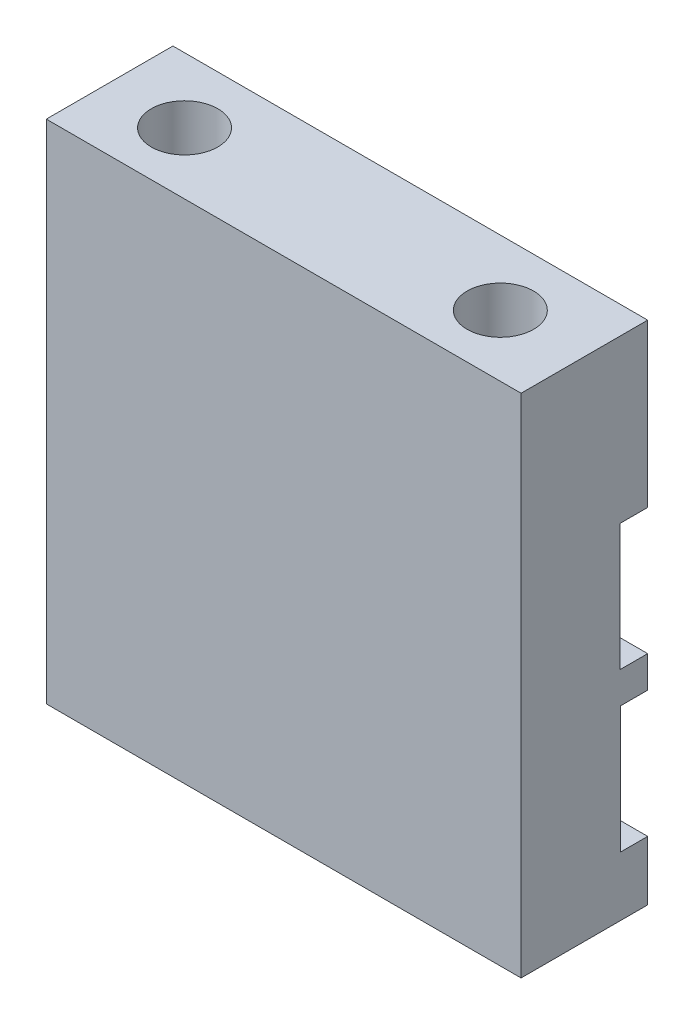
ISO-10303-21;
HEADER;
FILE_DESCRIPTION(('STEP AP214'),'2;1');
FILE_NAME('part.step','',(''),(''),'','','');
FILE_SCHEMA(('AUTOMOTIVE_DESIGN { 1 0 10303 214 1 1 1 1 }'));
ENDSEC;
DATA;
#1=APPLICATION_CONTEXT('core data for automotive mechanical design processes');
#2=APPLICATION_PROTOCOL_DEFINITION('international standard','automotive_design',2000,#1);
#3=PRODUCT_CONTEXT('',#1,'mechanical');
#4=PRODUCT('Part','Part','',(#3));
#5=PRODUCT_RELATED_PRODUCT_CATEGORY('part','',(#4));
#6=PRODUCT_DEFINITION_FORMATION('','',#4);
#7=PRODUCT_DEFINITION_CONTEXT('part definition',#1,'design');
#8=PRODUCT_DEFINITION('design','',#6,#7);
#9=PRODUCT_DEFINITION_SHAPE('','',#8);
#10=(LENGTH_UNIT() NAMED_UNIT(*) SI_UNIT(.MILLI.,.METRE.));
#11=(NAMED_UNIT(*) PLANE_ANGLE_UNIT() SI_UNIT($,.RADIAN.));
#12=(NAMED_UNIT(*) SI_UNIT($,.STERADIAN.) SOLID_ANGLE_UNIT());
#13=UNCERTAINTY_MEASURE_WITH_UNIT(LENGTH_MEASURE(1.E-05),#10,'distance_accuracy_value','');
#14=(GEOMETRIC_REPRESENTATION_CONTEXT(3) GLOBAL_UNCERTAINTY_ASSIGNED_CONTEXT((#13)) GLOBAL_UNIT_ASSIGNED_CONTEXT((#10,
#11,#12)) REPRESENTATION_CONTEXT('',''));
#15=CARTESIAN_POINT('',(0.,0.,0.));
#16=DIRECTION('',(0.,0.,1.));
#17=DIRECTION('',(1.,0.,0.));
#18=AXIS2_PLACEMENT_3D('',#15,#16,#17);
#19=CARTESIAN_POINT('',(0.,0.,-0.001));
#20=DIRECTION('',(0.,0.,1.));
#21=DIRECTION('',(1.,0.,0.));
#22=AXIS2_PLACEMENT_3D('',#19,#20,#21);
#23=PLANE('',#22);
#24=DIRECTION('',(0.,1.,0.));
#25=VECTOR('',#24,1.);
#26=CARTESIAN_POINT('',(15.,16.,-0.001));
#27=LINE('',#26,#25);
#28=CARTESIAN_POINT('',(15.,5.75000000000001,-0.001));
#29=VERTEX_POINT('',#28);
#30=CARTESIAN_POINT('',(15.,16.,-0.001));
#31=VERTEX_POINT('',#30);
#32=EDGE_CURVE('E204',#29,#31,#27,.T.);
#33=ORIENTED_EDGE('',*,*,#32,.F.);
#34=DIRECTION('',(-1.,0.,0.));
#35=VECTOR('',#34,1.);
#36=CARTESIAN_POINT('',(15.,5.75000000000001,-0.001));
#37=LINE('',#36,#35);
#38=CARTESIAN_POINT('',(-15.,5.75,-0.001));
#39=VERTEX_POINT('',#38);
#40=EDGE_CURVE('E164',#29,#39,#37,.T.);
#41=ORIENTED_EDGE('',*,*,#40,.T.);
#42=DIRECTION('',(0.,-1.,0.));
#43=VECTOR('',#42,1.);
#44=CARTESIAN_POINT('',(-15.,16.,-0.001));
#45=LINE('',#44,#43);
#46=CARTESIAN_POINT('',(-15.,16.,-0.001));
#47=VERTEX_POINT('',#46);
#48=EDGE_CURVE('E212',#47,#39,#45,.T.);
#49=ORIENTED_EDGE('',*,*,#48,.F.);
#50=DIRECTION('',(-1.,0.,0.));
#51=VECTOR('',#50,1.);
#52=CARTESIAN_POINT('',(-15.,16.,-0.001));
#53=LINE('',#52,#51);
#54=EDGE_CURVE('E208',#31,#47,#53,.T.);
#55=ORIENTED_EDGE('',*,*,#54,.F.);
#56=EDGE_LOOP('',(#33,#41,#49,#55));
#57=FACE_BOUND('',#56,.T.);
#58=ADVANCED_FACE('F41',(#57),#23,.F.);
#59=CARTESIAN_POINT('',(-15.,-2.25,-0.000999999999999021));
#60=VERTEX_POINT('',#59);
#61=CARTESIAN_POINT('',(-15.,-4.24996890886312,-0.001));
#62=VERTEX_POINT('',#61);
#63=EDGE_CURVE('E216',#60,#62,#45,.T.);
#64=ORIENTED_EDGE('',*,*,#63,.F.);
#65=DIRECTION('',(-1.,0.,0.));
#66=VECTOR('',#65,1.);
#67=CARTESIAN_POINT('',(15.,-2.25,-0.000999999999999021));
#68=LINE('',#67,#66);
#69=CARTESIAN_POINT('',(15.,-2.25,-0.001));
#70=VERTEX_POINT('',#69);
#71=EDGE_CURVE('E138',#70,#60,#68,.T.);
#72=ORIENTED_EDGE('',*,*,#71,.F.);
#73=CARTESIAN_POINT('',(15.,-4.24996890886311,-0.001));
#74=VERTEX_POINT('',#73);
#75=EDGE_CURVE('E151',#74,#70,#27,.T.);
#76=ORIENTED_EDGE('',*,*,#75,.F.);
#77=DIRECTION('',(-1.,0.,0.));
#78=VECTOR('',#77,1.);
#79=CARTESIAN_POINT('',(15.,-4.24996890886311,-0.001));
#80=LINE('',#79,#78);
#81=EDGE_CURVE('E177',#74,#62,#80,.T.);
#82=ORIENTED_EDGE('',*,*,#81,.T.);
#83=EDGE_LOOP('',(#64,#72,#76,#82));
#84=FACE_BOUND('',#83,.T.);
#85=ADVANCED_FACE('F254',(#84),#23,.F.);
#86=CARTESIAN_POINT('',(15.,16.,-0.001));
#87=DIRECTION('',(1.,0.,0.));
#88=DIRECTION('',(0.,1.,0.));
#89=AXIS2_PLACEMENT_3D('',#86,#87,#88);
#90=PLANE('',#89);
#91=DIRECTION('',(0.,0.,-1.));
#92=VECTOR('',#91,1.);
#93=CARTESIAN_POINT('',(15.,5.75000000000001,-0.001));
#94=LINE('',#93,#92);
#95=CARTESIAN_POINT('',(15.,5.75000000000001,1.749));
#96=VERTEX_POINT('',#95);
#97=EDGE_CURVE('E146',#96,#29,#94,.T.);
#98=ORIENTED_EDGE('',*,*,#97,.T.);
#99=ORIENTED_EDGE('',*,*,#32,.T.);
#100=DIRECTION('',(0.,0.,1.));
#101=VECTOR('',#100,1.);
#102=CARTESIAN_POINT('',(15.,16.,-0.001));
#103=LINE('',#102,#101);
#104=CARTESIAN_POINT('',(15.,16.,8.));
#105=VERTEX_POINT('',#104);
#106=EDGE_CURVE('E45',#31,#105,#103,.T.);
#107=ORIENTED_EDGE('',*,*,#106,.T.);
#108=DIRECTION('',(0.,1.,0.));
#109=VECTOR('',#108,1.);
#110=CARTESIAN_POINT('',(15.,16.,8.));
#111=LINE('',#110,#109);
#112=CARTESIAN_POINT('',(15.,-16.,8.));
#113=VERTEX_POINT('',#112);
#114=EDGE_CURVE('E167',#113,#105,#111,.T.);
#115=ORIENTED_EDGE('',*,*,#114,.F.);
#116=DIRECTION('',(0.,0.,1.));
#117=VECTOR('',#116,1.);
#118=CARTESIAN_POINT('',(15.,-16.,-0.001));
#119=LINE('',#118,#117);
#120=CARTESIAN_POINT('',(15.,-16.,-0.001));
#121=VERTEX_POINT('',#120);
#122=EDGE_CURVE('E11',#121,#113,#119,.T.);
#123=ORIENTED_EDGE('',*,*,#122,.F.);
#124=CARTESIAN_POINT('',(15.,-12.2499689088631,-0.001));
#125=VERTEX_POINT('',#124);
#126=EDGE_CURVE('E205',#121,#125,#27,.T.);
#127=ORIENTED_EDGE('',*,*,#126,.T.);
#128=DIRECTION('',(0.,0.,1.));
#129=VECTOR('',#128,1.);
#130=CARTESIAN_POINT('',(15.,-12.2499689088631,-0.000999999999999021));
#131=LINE('',#130,#129);
#132=CARTESIAN_POINT('',(15.,-12.2499689088631,1.71554435830606));
#133=VERTEX_POINT('',#132);
#134=EDGE_CURVE('E66',#125,#133,#131,.T.);
#135=ORIENTED_EDGE('',*,*,#134,.T.);
#136=DIRECTION('',(0.,1.,0.));
#137=VECTOR('',#136,1.);
#138=CARTESIAN_POINT('',(15.,-4.24996890886311,1.71554435830606));
#139=LINE('',#138,#137);
#140=CARTESIAN_POINT('',(15.,-4.24996890886311,1.71554435830606));
#141=VERTEX_POINT('',#140);
#142=EDGE_CURVE('E189',#133,#141,#139,.T.);
#143=ORIENTED_EDGE('',*,*,#142,.T.);
#144=DIRECTION('',(0.,0.,-1.));
#145=VECTOR('',#144,1.);
#146=CARTESIAN_POINT('',(15.,-4.24996890886311,-0.001));
#147=LINE('',#146,#145);
#148=EDGE_CURVE('E172',#141,#74,#147,.T.);
#149=ORIENTED_EDGE('',*,*,#148,.T.);
#150=ORIENTED_EDGE('',*,*,#75,.T.);
#151=DIRECTION('',(0.,0.,1.));
#152=VECTOR('',#151,1.);
#153=CARTESIAN_POINT('',(15.,-2.25,-0.000999999999999021));
#154=LINE('',#153,#152);
#155=CARTESIAN_POINT('',(15.,-2.25,1.749));
#156=VERTEX_POINT('',#155);
#157=EDGE_CURVE('E58',#70,#156,#154,.T.);
#158=ORIENTED_EDGE('',*,*,#157,.T.);
#159=DIRECTION('',(0.,1.,0.));
#160=VECTOR('',#159,1.);
#161=CARTESIAN_POINT('',(15.,5.75000000000001,1.749));
#162=LINE('',#161,#160);
#163=EDGE_CURVE('E141',#156,#96,#162,.T.);
#164=ORIENTED_EDGE('',*,*,#163,.T.);
#165=EDGE_LOOP('',(#98,#99,#107,#115,#123,#127,#135,#143,#149,#150,#158,#164));
#166=FACE_BOUND('',#165,.T.);
#167=ADVANCED_FACE('F43',(#166),#90,.T.);
#168=CARTESIAN_POINT('',(-15.,-16.,-0.001));
#169=DIRECTION('',(0.,-1.,0.));
#170=DIRECTION('',(0.,0.,-1.));
#171=AXIS2_PLACEMENT_3D('',#168,#169,#170);
#172=PLANE('',#171);
#173=ORIENTED_EDGE('',*,*,#122,.T.);
#174=DIRECTION('',(1.,0.,0.));
#175=VECTOR('',#174,1.);
#176=CARTESIAN_POINT('',(-15.,-16.,8.));
#177=LINE('',#176,#175);
#178=CARTESIAN_POINT('',(-15.,-16.,8.));
#179=VERTEX_POINT('',#178);
#180=EDGE_CURVE('E201',#179,#113,#177,.T.);
#181=ORIENTED_EDGE('',*,*,#180,.F.);
#182=DIRECTION('',(0.,0.,1.));
#183=VECTOR('',#182,1.);
#184=CARTESIAN_POINT('',(-15.,-16.,-0.001));
#185=LINE('',#184,#183);
#186=CARTESIAN_POINT('',(-15.,-16.,-0.001));
#187=VERTEX_POINT('',#186);
#188=EDGE_CURVE('E50',#187,#179,#185,.T.);
#189=ORIENTED_EDGE('',*,*,#188,.F.);
#190=DIRECTION('',(1.,0.,0.));
#191=VECTOR('',#190,1.);
#192=CARTESIAN_POINT('',(-15.,-16.,-0.001));
#193=LINE('',#192,#191);
#194=EDGE_CURVE('E215',#187,#121,#193,.T.);
#195=ORIENTED_EDGE('',*,*,#194,.T.);
#196=EDGE_LOOP('',(#173,#181,#189,#195));
#197=FACE_BOUND('',#196,.T.);
#198=ADVANCED_FACE('F233',(#197),#172,.T.);
#199=CARTESIAN_POINT('',(-15.,16.,-0.001));
#200=DIRECTION('',(-1.,0.,0.));
#201=DIRECTION('',(0.,0.,1.));
#202=AXIS2_PLACEMENT_3D('',#199,#200,#201);
#203=PLANE('',#202);
#204=DIRECTION('',(0.,0.,-1.));
#205=VECTOR('',#204,1.);
#206=CARTESIAN_POINT('',(-15.,5.75,-0.001));
#207=LINE('',#206,#205);
#208=CARTESIAN_POINT('',(-15.,5.75,1.749));
#209=VERTEX_POINT('',#208);
#210=EDGE_CURVE('E152',#209,#39,#207,.T.);
#211=ORIENTED_EDGE('',*,*,#210,.F.);
#212=DIRECTION('',(0.,1.,0.));
#213=VECTOR('',#212,1.);
#214=CARTESIAN_POINT('',(-15.,5.75,1.749));
#215=LINE('',#214,#213);
#216=CARTESIAN_POINT('',(-15.,-2.25,1.749));
#217=VERTEX_POINT('',#216);
#218=EDGE_CURVE('E154',#217,#209,#215,.T.);
#219=ORIENTED_EDGE('',*,*,#218,.F.);
#220=DIRECTION('',(0.,0.,1.));
#221=VECTOR('',#220,1.);
#222=CARTESIAN_POINT('',(-15.,-2.25,-0.000999999999999021));
#223=LINE('',#222,#221);
#224=EDGE_CURVE('E133',#60,#217,#223,.T.);
#225=ORIENTED_EDGE('',*,*,#224,.F.);
#226=ORIENTED_EDGE('',*,*,#63,.T.);
#227=DIRECTION('',(0.,0.,-1.));
#228=VECTOR('',#227,1.);
#229=CARTESIAN_POINT('',(-15.,-4.24996890886312,-0.001));
#230=LINE('',#229,#228);
#231=CARTESIAN_POINT('',(-15.,-4.24996890886312,1.71554435830606));
#232=VERTEX_POINT('',#231);
#233=EDGE_CURVE('E181',#232,#62,#230,.T.);
#234=ORIENTED_EDGE('',*,*,#233,.F.);
#235=DIRECTION('',(0.,1.,0.));
#236=VECTOR('',#235,1.);
#237=CARTESIAN_POINT('',(-15.,-4.24996890886312,1.71554435830606));
#238=LINE('',#237,#236);
#239=CARTESIAN_POINT('',(-15.,-12.2499689088631,1.71554435830606));
#240=VERTEX_POINT('',#239);
#241=EDGE_CURVE('E183',#240,#232,#238,.T.);
#242=ORIENTED_EDGE('',*,*,#241,.F.);
#243=DIRECTION('',(0.,0.,1.));
#244=VECTOR('',#243,1.);
#245=CARTESIAN_POINT('',(-15.,-12.2499689088631,-0.000999999999999021));
#246=LINE('',#245,#244);
#247=CARTESIAN_POINT('',(-15.,-12.2499689088631,-0.000999999999999021));
#248=VERTEX_POINT('',#247);
#249=EDGE_CURVE('E162',#248,#240,#246,.T.);
#250=ORIENTED_EDGE('',*,*,#249,.F.);
#251=EDGE_CURVE('E211',#248,#187,#45,.T.);
#252=ORIENTED_EDGE('',*,*,#251,.T.);
#253=ORIENTED_EDGE('',*,*,#188,.T.);
#254=DIRECTION('',(0.,-1.,0.));
#255=VECTOR('',#254,1.);
#256=CARTESIAN_POINT('',(-15.,16.,8.));
#257=LINE('',#256,#255);
#258=CARTESIAN_POINT('',(-15.,16.,8.));
#259=VERTEX_POINT('',#258);
#260=EDGE_CURVE('E198',#259,#179,#257,.T.);
#261=ORIENTED_EDGE('',*,*,#260,.F.);
#262=DIRECTION('',(0.,0.,1.));
#263=VECTOR('',#262,1.);
#264=CARTESIAN_POINT('',(-15.,16.,-0.001));
#265=LINE('',#264,#263);
#266=EDGE_CURVE('E219',#47,#259,#265,.T.);
#267=ORIENTED_EDGE('',*,*,#266,.F.);
#268=ORIENTED_EDGE('',*,*,#48,.T.);
#269=EDGE_LOOP('',(#211,#219,#225,#226,#234,#242,#250,#252,#253,#261,#267,#268));
#270=FACE_BOUND('',#269,.T.);
#271=ADVANCED_FACE('F244',(#270),#203,.T.);
#272=CARTESIAN_POINT('',(-15.,16.,-0.001));
#273=DIRECTION('',(0.,1.,0.));
#274=DIRECTION('',(0.,0.,1.));
#275=AXIS2_PLACEMENT_3D('',#272,#273,#274);
#276=PLANE('',#275);
#277=CARTESIAN_POINT('',(-10.1531724380781,16.,4.11086304959629));
#278=DIRECTION('',(0.,1.,0.));
#279=DIRECTION('',(0.,0.,1.));
#280=AXIS2_PLACEMENT_3D('',#277,#278,#279);
#281=CIRCLE('',#280,2.1);
#282=CARTESIAN_POINT('',(-10.1531724380781,16.,6.21086304959629));
#283=VERTEX_POINT('',#282);
#284=EDGE_CURVE('E444',#283,#283,#281,.T.);
#285=ORIENTED_EDGE('',*,*,#284,.F.);
#286=EDGE_LOOP('',(#285));
#287=FACE_BOUND('',#286,.T.);
#288=CARTESIAN_POINT('',(9.80081366820717,16.,4.11086304959631));
#289=DIRECTION('',(0.,1.,0.));
#290=DIRECTION('',(0.,0.,1.));
#291=AXIS2_PLACEMENT_3D('',#288,#289,#290);
#292=CIRCLE('',#291,2.1);
#293=CARTESIAN_POINT('',(9.80081366820717,16.,6.21086304959631));
#294=VERTEX_POINT('',#293);
#295=EDGE_CURVE('E447',#294,#294,#292,.T.);
#296=ORIENTED_EDGE('',*,*,#295,.F.);
#297=EDGE_LOOP('',(#296));
#298=FACE_BOUND('',#297,.T.);
#299=ORIENTED_EDGE('',*,*,#266,.T.);
#300=DIRECTION('',(-1.,0.,0.));
#301=VECTOR('',#300,1.);
#302=CARTESIAN_POINT('',(-15.,16.,8.));
#303=LINE('',#302,#301);
#304=EDGE_CURVE('E195',#105,#259,#303,.T.);
#305=ORIENTED_EDGE('',*,*,#304,.F.);
#306=ORIENTED_EDGE('',*,*,#106,.F.);
#307=ORIENTED_EDGE('',*,*,#54,.T.);
#308=EDGE_LOOP('',(#299,#305,#306,#307));
#309=FACE_BOUND('',#308,.T.);
#310=ADVANCED_FACE('F226',(#287,#298,#309),#276,.T.);
#311=ORIENTED_EDGE('',*,*,#251,.F.);
#312=DIRECTION('',(-1.,0.,0.));
#313=VECTOR('',#312,1.);
#314=CARTESIAN_POINT('',(15.,-12.2499689088631,-0.000999999999999021));
#315=LINE('',#314,#313);
#316=EDGE_CURVE('E170',#125,#248,#315,.T.);
#317=ORIENTED_EDGE('',*,*,#316,.F.);
#318=ORIENTED_EDGE('',*,*,#126,.F.);
#319=ORIENTED_EDGE('',*,*,#194,.F.);
#320=EDGE_LOOP('',(#311,#317,#318,#319));
#321=FACE_BOUND('',#320,.T.);
#322=ADVANCED_FACE('F238',(#321),#23,.F.);
#323=CARTESIAN_POINT('',(0.,0.,8.));
#324=DIRECTION('',(0.,0.,1.));
#325=DIRECTION('',(1.,0.,0.));
#326=AXIS2_PLACEMENT_3D('',#323,#324,#325);
#327=PLANE('',#326);
#328=ORIENTED_EDGE('',*,*,#114,.T.);
#329=ORIENTED_EDGE('',*,*,#304,.T.);
#330=ORIENTED_EDGE('',*,*,#260,.T.);
#331=ORIENTED_EDGE('',*,*,#180,.T.);
#332=EDGE_LOOP('',(#328,#329,#330,#331));
#333=FACE_BOUND('',#332,.T.);
#334=ADVANCED_FACE('F229',(#333),#327,.T.);
#335=CARTESIAN_POINT('',(15.,-4.24996890886311,-0.001));
#336=DIRECTION('',(0.,1.,0.));
#337=DIRECTION('',(0.,0.,1.));
#338=AXIS2_PLACEMENT_3D('',#335,#336,#337);
#339=PLANE('',#338);
#340=ORIENTED_EDGE('',*,*,#233,.T.);
#341=ORIENTED_EDGE('',*,*,#81,.F.);
#342=ORIENTED_EDGE('',*,*,#148,.F.);
#343=DIRECTION('',(-1.,0.,0.));
#344=VECTOR('',#343,1.);
#345=CARTESIAN_POINT('',(15.,-4.24996890886311,1.71554435830606));
#346=LINE('',#345,#344);
#347=EDGE_CURVE('E175',#141,#232,#346,.T.);
#348=ORIENTED_EDGE('',*,*,#347,.T.);
#349=EDGE_LOOP('',(#340,#341,#342,#348));
#350=FACE_BOUND('',#349,.T.);
#351=ADVANCED_FACE('F271',(#350),#339,.F.);
#352=CARTESIAN_POINT('',(15.,-4.24996890886311,1.71554435830606));
#353=DIRECTION('',(0.,0.,1.));
#354=DIRECTION('',(0.,-1.,0.));
#355=AXIS2_PLACEMENT_3D('',#352,#353,#354);
#356=PLANE('',#355);
#357=ORIENTED_EDGE('',*,*,#241,.T.);
#358=ORIENTED_EDGE('',*,*,#347,.F.);
#359=ORIENTED_EDGE('',*,*,#142,.F.);
#360=DIRECTION('',(-1.,0.,0.));
#361=VECTOR('',#360,1.);
#362=CARTESIAN_POINT('',(15.,-12.2499689088631,1.71554435830606));
#363=LINE('',#362,#361);
#364=EDGE_CURVE('E173',#133,#240,#363,.T.);
#365=ORIENTED_EDGE('',*,*,#364,.T.);
#366=EDGE_LOOP('',(#357,#358,#359,#365));
#367=FACE_BOUND('',#366,.T.);
#368=ADVANCED_FACE('F248',(#367),#356,.F.);
#369=CARTESIAN_POINT('',(15.,-12.2499689088631,-0.000999999999999021));
#370=DIRECTION('',(0.,-1.,0.));
#371=DIRECTION('',(0.,0.,-1.));
#372=AXIS2_PLACEMENT_3D('',#369,#370,#371);
#373=PLANE('',#372);
#374=ORIENTED_EDGE('',*,*,#249,.T.);
#375=ORIENTED_EDGE('',*,*,#364,.F.);
#376=ORIENTED_EDGE('',*,*,#134,.F.);
#377=ORIENTED_EDGE('',*,*,#316,.T.);
#378=EDGE_LOOP('',(#374,#375,#376,#377));
#379=FACE_BOUND('',#378,.T.);
#380=ADVANCED_FACE('F240',(#379),#373,.F.);
#381=CARTESIAN_POINT('',(15.,5.75000000000001,-0.001));
#382=DIRECTION('',(0.,1.,0.));
#383=DIRECTION('',(-1.,0.,0.));
#384=AXIS2_PLACEMENT_3D('',#381,#382,#383);
#385=PLANE('',#384);
#386=ORIENTED_EDGE('',*,*,#210,.T.);
#387=ORIENTED_EDGE('',*,*,#40,.F.);
#388=ORIENTED_EDGE('',*,*,#97,.F.);
#389=DIRECTION('',(-1.,0.,0.));
#390=VECTOR('',#389,1.);
#391=CARTESIAN_POINT('',(15.,5.75000000000001,1.749));
#392=LINE('',#391,#390);
#393=EDGE_CURVE('E137',#96,#209,#392,.T.);
#394=ORIENTED_EDGE('',*,*,#393,.T.);
#395=EDGE_LOOP('',(#386,#387,#388,#394));
#396=FACE_BOUND('',#395,.T.);
#397=ADVANCED_FACE('F257',(#396),#385,.F.);
#398=CARTESIAN_POINT('',(15.,5.75000000000001,1.749));
#399=DIRECTION('',(0.,0.,1.));
#400=DIRECTION('',(0.,-1.,0.));
#401=AXIS2_PLACEMENT_3D('',#398,#399,#400);
#402=PLANE('',#401);
#403=ORIENTED_EDGE('',*,*,#218,.T.);
#404=ORIENTED_EDGE('',*,*,#393,.F.);
#405=ORIENTED_EDGE('',*,*,#163,.F.);
#406=DIRECTION('',(-1.,0.,0.));
#407=VECTOR('',#406,1.);
#408=CARTESIAN_POINT('',(15.,-2.25,1.749));
#409=LINE('',#408,#407);
#410=EDGE_CURVE('E129',#156,#217,#409,.T.);
#411=ORIENTED_EDGE('',*,*,#410,.T.);
#412=EDGE_LOOP('',(#403,#404,#405,#411));
#413=FACE_BOUND('',#412,.T.);
#414=ADVANCED_FACE('F142',(#413),#402,.F.);
#415=CARTESIAN_POINT('',(15.,-2.25,-0.000999999999999021));
#416=DIRECTION('',(0.,-1.,0.));
#417=DIRECTION('',(1.,0.,0.));
#418=AXIS2_PLACEMENT_3D('',#415,#416,#417);
#419=PLANE('',#418);
#420=ORIENTED_EDGE('',*,*,#224,.T.);
#421=ORIENTED_EDGE('',*,*,#410,.F.);
#422=ORIENTED_EDGE('',*,*,#157,.F.);
#423=ORIENTED_EDGE('',*,*,#71,.T.);
#424=EDGE_LOOP('',(#420,#421,#422,#423));
#425=FACE_BOUND('',#424,.T.);
#426=ADVANCED_FACE('F131',(#425),#419,.F.);
#427=CARTESIAN_POINT('',(9.80081366820717,10.,4.11086304959631));
#428=DIRECTION('',(0.,1.,0.));
#429=DIRECTION('',(0.,0.,1.));
#430=AXIS2_PLACEMENT_3D('',#427,#428,#429);
#431=CYLINDRICAL_SURFACE('',#430,2.1);
#432=CARTESIAN_POINT('',(9.80081366820717,10.,4.11086304959631));
#433=DIRECTION('',(0.,1.,0.));
#434=DIRECTION('',(0.,0.,1.));
#435=AXIS2_PLACEMENT_3D('',#432,#433,#434);
#436=CIRCLE('',#435,2.1);
#437=CARTESIAN_POINT('',(9.80081366820717,10.,6.21086304959631));
#438=VERTEX_POINT('',#437);
#439=EDGE_CURVE('E157',#438,#438,#436,.T.);
#440=ORIENTED_EDGE('',*,*,#439,.F.);
#441=EDGE_LOOP('',(#440));
#442=FACE_BOUND('',#441,.T.);
#443=ORIENTED_EDGE('',*,*,#295,.T.);
#444=EDGE_LOOP('',(#443));
#445=FACE_BOUND('',#444,.T.);
#446=ADVANCED_FACE('F383',(#442,#445),#431,.F.);
#447=CARTESIAN_POINT('',(9.80081366820717,10.,4.11086304959631));
#448=DIRECTION('',(0.,1.,0.));
#449=DIRECTION('',(0.,0.,1.));
#450=AXIS2_PLACEMENT_3D('',#447,#448,#449);
#451=PLANE('',#450);
#452=ORIENTED_EDGE('',*,*,#439,.T.);
#453=EDGE_LOOP('',(#452));
#454=FACE_BOUND('',#453,.T.);
#455=ADVANCED_FACE('F393',(#454),#451,.T.);
#456=CARTESIAN_POINT('',(-10.1531724380781,10.,4.11086304959629));
#457=DIRECTION('',(0.,1.,0.));
#458=DIRECTION('',(0.,0.,1.));
#459=AXIS2_PLACEMENT_3D('',#456,#457,#458);
#460=CYLINDRICAL_SURFACE('',#459,2.1);
#461=CARTESIAN_POINT('',(-10.1531724380781,10.,4.11086304959629));
#462=DIRECTION('',(0.,1.,0.));
#463=DIRECTION('',(0.,0.,1.));
#464=AXIS2_PLACEMENT_3D('',#461,#462,#463);
#465=CIRCLE('',#464,2.1);
#466=CARTESIAN_POINT('',(-10.1531724380781,10.,6.21086304959629));
#467=VERTEX_POINT('',#466);
#468=EDGE_CURVE('E180',#467,#467,#465,.T.);
#469=ORIENTED_EDGE('',*,*,#468,.F.);
#470=EDGE_LOOP('',(#469));
#471=FACE_BOUND('',#470,.T.);
#472=ORIENTED_EDGE('',*,*,#284,.T.);
#473=EDGE_LOOP('',(#472));
#474=FACE_BOUND('',#473,.T.);
#475=ADVANCED_FACE('F400',(#471,#474),#460,.F.);
#476=CARTESIAN_POINT('',(-10.1531724380781,10.,4.11086304959629));
#477=DIRECTION('',(0.,1.,0.));
#478=DIRECTION('',(0.,0.,1.));
#479=AXIS2_PLACEMENT_3D('',#476,#477,#478);
#480=PLANE('',#479);
#481=ORIENTED_EDGE('',*,*,#468,.T.);
#482=EDGE_LOOP('',(#481));
#483=FACE_BOUND('',#482,.T.);
#484=ADVANCED_FACE('F408',(#483),#480,.T.);
#485=CLOSED_SHELL('',(#58,#85,#167,#198,#271,#310,#322,#334,#351,#368,#380,#397,#414,#426,#446,
#455,#475,#484));
#486=MANIFOLD_SOLID_BREP('B2',#485);
#487=ADVANCED_BREP_SHAPE_REPRESENTATION('',(#18,#486),#14);
#488=SHAPE_DEFINITION_REPRESENTATION(#9,#487);
ENDSEC;
END-ISO-10303-21;
